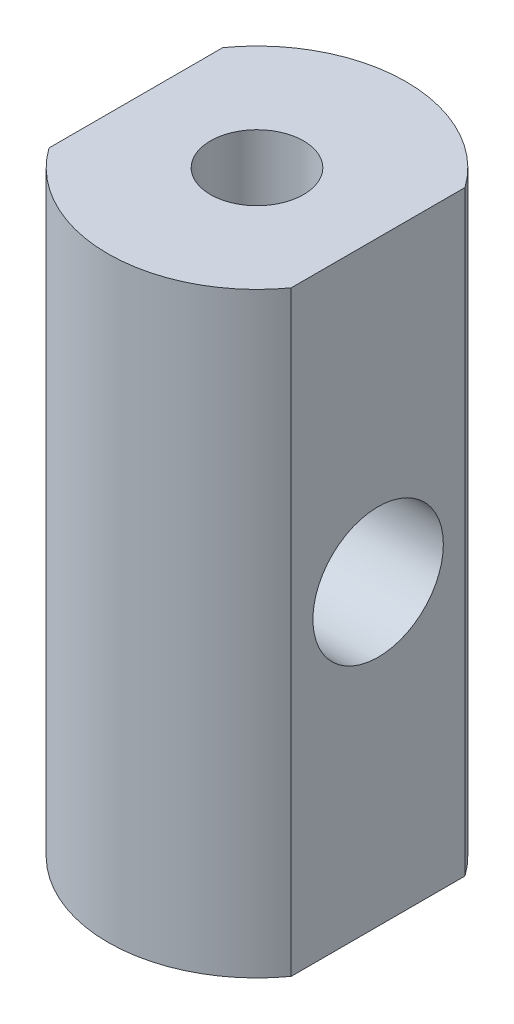
ISO-10303-21;
HEADER;
FILE_DESCRIPTION(('STEP AP214'),'2;1');
FILE_NAME('part.step','',(''),(''),'','','');
FILE_SCHEMA(('AUTOMOTIVE_DESIGN { 1 0 10303 214 1 1 1 1 }'));
ENDSEC;
DATA;
#1=APPLICATION_CONTEXT('core data for automotive mechanical design processes');
#2=APPLICATION_PROTOCOL_DEFINITION('international standard','automotive_design',2000,#1);
#3=PRODUCT_CONTEXT('',#1,'mechanical');
#4=PRODUCT('Part','Part','',(#3));
#5=PRODUCT_RELATED_PRODUCT_CATEGORY('part','',(#4));
#6=PRODUCT_DEFINITION_FORMATION('','',#4);
#7=PRODUCT_DEFINITION_CONTEXT('part definition',#1,'design');
#8=PRODUCT_DEFINITION('design','',#6,#7);
#9=PRODUCT_DEFINITION_SHAPE('','',#8);
#10=(LENGTH_UNIT() NAMED_UNIT(*) SI_UNIT(.MILLI.,.METRE.));
#11=(NAMED_UNIT(*) PLANE_ANGLE_UNIT() SI_UNIT($,.RADIAN.));
#12=(NAMED_UNIT(*) SI_UNIT($,.STERADIAN.) SOLID_ANGLE_UNIT());
#13=UNCERTAINTY_MEASURE_WITH_UNIT(LENGTH_MEASURE(1.E-05),#10,'distance_accuracy_value','');
#14=(GEOMETRIC_REPRESENTATION_CONTEXT(3) GLOBAL_UNCERTAINTY_ASSIGNED_CONTEXT((#13)) GLOBAL_UNIT_ASSIGNED_CONTEXT((#10,
#11,#12)) REPRESENTATION_CONTEXT('',''));
#15=CARTESIAN_POINT('',(0.,0.,0.));
#16=DIRECTION('',(0.,0.,1.));
#17=DIRECTION('',(1.,0.,0.));
#18=AXIS2_PLACEMENT_3D('',#15,#16,#17);
#19=CARTESIAN_POINT('',(0.,32.,0.));
#20=DIRECTION('',(0.,-1.,0.));
#21=DIRECTION('',(0.,0.,-1.));
#22=AXIS2_PLACEMENT_3D('',#19,#20,#21);
#23=CYLINDRICAL_SURFACE('',#22,8.);
#24=DIRECTION('',(0.,-1.,0.));
#25=VECTOR('',#24,1.);
#26=CARTESIAN_POINT('',(6.49999999999999,32.,4.66368952654442));
#27=LINE('',#26,#25);
#28=CARTESIAN_POINT('',(6.49999999999999,32.,4.66368952654442));
#29=VERTEX_POINT('',#28);
#30=CARTESIAN_POINT('',(6.5,0.,4.66368952654441));
#31=VERTEX_POINT('',#30);
#32=EDGE_CURVE('E66',#29,#31,#27,.T.);
#33=ORIENTED_EDGE('',*,*,#32,.F.);
#34=CARTESIAN_POINT('',(0.,32.,0.));
#35=DIRECTION('',(0.,1.,0.));
#36=DIRECTION('',(0.,0.,1.));
#37=AXIS2_PLACEMENT_3D('',#34,#35,#36);
#38=CIRCLE('',#37,8.);
#39=CARTESIAN_POINT('',(-6.49999999999999,32.,4.66368952654442));
#40=VERTEX_POINT('',#39);
#41=EDGE_CURVE('E101',#40,#29,#38,.T.);
#42=ORIENTED_EDGE('',*,*,#41,.F.);
#43=DIRECTION('',(0.,-1.,0.));
#44=VECTOR('',#43,1.);
#45=CARTESIAN_POINT('',(-6.49999999999999,32.,4.66368952654442));
#46=LINE('',#45,#44);
#47=CARTESIAN_POINT('',(-6.5,0.,4.66368952654441));
#48=VERTEX_POINT('',#47);
#49=EDGE_CURVE('E89',#48,#40,#46,.F.);
#50=ORIENTED_EDGE('',*,*,#49,.F.);
#51=CARTESIAN_POINT('',(0.,0.,0.));
#52=DIRECTION('',(0.,1.,0.));
#53=DIRECTION('',(0.,0.,1.));
#54=AXIS2_PLACEMENT_3D('',#51,#52,#53);
#55=CIRCLE('',#54,8.);
#56=EDGE_CURVE('E99',#48,#31,#55,.T.);
#57=ORIENTED_EDGE('',*,*,#56,.T.);
#58=EDGE_LOOP('',(#33,#42,#50,#57));
#59=FACE_BOUND('',#58,.T.);
#60=ADVANCED_FACE('F45',(#59),#23,.T.);
#61=DIRECTION('',(0.,-1.,0.));
#62=VECTOR('',#61,1.);
#63=CARTESIAN_POINT('',(6.49999999999999,32.,-4.66368952654442));
#64=LINE('',#63,#62);
#65=CARTESIAN_POINT('',(6.5,0.,-4.66368952654441));
#66=VERTEX_POINT('',#65);
#67=CARTESIAN_POINT('',(6.49999999999999,32.,-4.66368952654442));
#68=VERTEX_POINT('',#67);
#69=EDGE_CURVE('E125',#66,#68,#64,.F.);
#70=ORIENTED_EDGE('',*,*,#69,.F.);
#71=CARTESIAN_POINT('',(-6.5,0.,-4.66368952654441));
#72=VERTEX_POINT('',#71);
#73=EDGE_CURVE('E105',#66,#72,#55,.T.);
#74=ORIENTED_EDGE('',*,*,#73,.T.);
#75=DIRECTION('',(0.,-1.,0.));
#76=VECTOR('',#75,1.);
#77=CARTESIAN_POINT('',(-6.49999999999999,32.,-4.66368952654442));
#78=LINE('',#77,#76);
#79=CARTESIAN_POINT('',(-6.49999999999999,32.,-4.66368952654442));
#80=VERTEX_POINT('',#79);
#81=EDGE_CURVE('E59',#80,#72,#78,.T.);
#82=ORIENTED_EDGE('',*,*,#81,.F.);
#83=EDGE_CURVE('E95',#68,#80,#38,.T.);
#84=ORIENTED_EDGE('',*,*,#83,.F.);
#85=EDGE_LOOP('',(#70,#74,#82,#84));
#86=FACE_BOUND('',#85,.T.);
#87=ADVANCED_FACE('F152',(#86),#23,.T.);
#88=CARTESIAN_POINT('',(0.,32.,0.));
#89=DIRECTION('',(0.,1.,0.));
#90=DIRECTION('',(0.,0.,1.));
#91=AXIS2_PLACEMENT_3D('',#88,#89,#90);
#92=PLANE('',#91);
#93=CARTESIAN_POINT('',(0.,32.,0.));
#94=DIRECTION('',(0.,1.,0.));
#95=DIRECTION('',(0.,0.,1.));
#96=AXIS2_PLACEMENT_3D('',#93,#94,#95);
#97=CIRCLE('',#96,2.5);
#98=CARTESIAN_POINT('',(0.,32.,2.5));
#99=VERTEX_POINT('',#98);
#100=EDGE_CURVE('E109',#99,#99,#97,.T.);
#101=ORIENTED_EDGE('',*,*,#100,.F.);
#102=EDGE_LOOP('',(#101));
#103=FACE_BOUND('',#102,.T.);
#104=ORIENTED_EDGE('',*,*,#41,.T.);
#105=DIRECTION('',(0.,0.,-1.));
#106=VECTOR('',#105,1.);
#107=CARTESIAN_POINT('',(6.49999999999999,32.,0.));
#108=LINE('',#107,#106);
#109=EDGE_CURVE('E121',#29,#68,#108,.T.);
#110=ORIENTED_EDGE('',*,*,#109,.T.);
#111=ORIENTED_EDGE('',*,*,#83,.T.);
#112=DIRECTION('',(0.,0.,1.));
#113=VECTOR('',#112,1.);
#114=CARTESIAN_POINT('',(-6.49999999999999,32.,0.));
#115=LINE('',#114,#113);
#116=EDGE_CURVE('E127',#80,#40,#115,.T.);
#117=ORIENTED_EDGE('',*,*,#116,.T.);
#118=EDGE_LOOP('',(#104,#110,#111,#117));
#119=FACE_BOUND('',#118,.T.);
#120=ADVANCED_FACE('F157',(#103,#119),#92,.T.);
#121=CARTESIAN_POINT('',(0.,0.,0.));
#122=DIRECTION('',(0.,1.,0.));
#123=DIRECTION('',(0.,0.,1.));
#124=AXIS2_PLACEMENT_3D('',#121,#122,#123);
#125=PLANE('',#124);
#126=CARTESIAN_POINT('',(0.,0.,0.));
#127=DIRECTION('',(0.,-1.,0.));
#128=DIRECTION('',(0.,0.,-1.));
#129=AXIS2_PLACEMENT_3D('',#126,#127,#128);
#130=CIRCLE('',#129,2.5);
#131=CARTESIAN_POINT('',(0.,0.,-2.5));
#132=VERTEX_POINT('',#131);
#133=EDGE_CURVE('E118',#132,#132,#130,.T.);
#134=ORIENTED_EDGE('',*,*,#133,.F.);
#135=EDGE_LOOP('',(#134));
#136=FACE_BOUND('',#135,.T.);
#137=DIRECTION('',(0.,0.,-1.));
#138=VECTOR('',#137,1.);
#139=CARTESIAN_POINT('',(6.5,0.,0.));
#140=LINE('',#139,#138);
#141=EDGE_CURVE('E11',#31,#66,#140,.T.);
#142=ORIENTED_EDGE('',*,*,#141,.F.);
#143=ORIENTED_EDGE('',*,*,#56,.F.);
#144=DIRECTION('',(0.,0.,1.));
#145=VECTOR('',#144,1.);
#146=CARTESIAN_POINT('',(-6.5,0.,0.));
#147=LINE('',#146,#145);
#148=EDGE_CURVE('E52',#72,#48,#147,.T.);
#149=ORIENTED_EDGE('',*,*,#148,.F.);
#150=ORIENTED_EDGE('',*,*,#73,.F.);
#151=EDGE_LOOP('',(#142,#143,#149,#150));
#152=FACE_BOUND('',#151,.T.);
#153=ADVANCED_FACE('F104',(#136,#152),#125,.F.);
#154=CARTESIAN_POINT('',(0.,26.,0.));
#155=DIRECTION('',(0.,1.,0.));
#156=DIRECTION('',(0.,0.,1.));
#157=AXIS2_PLACEMENT_3D('',#154,#155,#156);
#158=CONICAL_SURFACE('',#157,2.5,1.02974425867665);
#159=CARTESIAN_POINT('',(0.,24.4978484524311,0.));
#160=VERTEX_POINT('',#159);
#161=VERTEX_LOOP('',#160);
#162=FACE_BOUND('',#161,.T.);
#163=CARTESIAN_POINT('',(0.,26.,0.));
#164=DIRECTION('',(0.,1.,0.));
#165=DIRECTION('',(0.,0.,1.));
#166=AXIS2_PLACEMENT_3D('',#163,#164,#165);
#167=CIRCLE('',#166,2.5);
#168=CARTESIAN_POINT('',(0.,26.,2.5));
#169=VERTEX_POINT('',#168);
#170=EDGE_CURVE('E106',#169,#169,#167,.T.);
#171=ORIENTED_EDGE('',*,*,#170,.T.);
#172=EDGE_LOOP('',(#171));
#173=FACE_BOUND('',#172,.T.);
#174=ADVANCED_FACE('F171',(#162,#173),#158,.F.);
#175=CARTESIAN_POINT('',(0.,32.,0.));
#176=DIRECTION('',(0.,1.,0.));
#177=DIRECTION('',(0.,0.,1.));
#178=AXIS2_PLACEMENT_3D('',#175,#176,#177);
#179=CYLINDRICAL_SURFACE('',#178,2.5);
#180=ORIENTED_EDGE('',*,*,#170,.F.);
#181=EDGE_LOOP('',(#180));
#182=FACE_BOUND('',#181,.T.);
#183=ORIENTED_EDGE('',*,*,#100,.T.);
#184=EDGE_LOOP('',(#183));
#185=FACE_BOUND('',#184,.T.);
#186=ADVANCED_FACE('F177',(#182,#185),#179,.F.);
#187=CARTESIAN_POINT('',(0.,6.,0.));
#188=DIRECTION('',(0.,-1.,0.));
#189=DIRECTION('',(0.,0.,-1.));
#190=AXIS2_PLACEMENT_3D('',#187,#188,#189);
#191=CONICAL_SURFACE('',#190,2.5,1.02974425867665);
#192=CARTESIAN_POINT('',(0.,7.5021515475689,0.));
#193=VERTEX_POINT('',#192);
#194=VERTEX_LOOP('',#193);
#195=FACE_BOUND('',#194,.T.);
#196=CARTESIAN_POINT('',(0.,6.,0.));
#197=DIRECTION('',(0.,-1.,0.));
#198=DIRECTION('',(0.,0.,-1.));
#199=AXIS2_PLACEMENT_3D('',#196,#197,#198);
#200=CIRCLE('',#199,2.5);
#201=CARTESIAN_POINT('',(0.,6.,-2.5));
#202=VERTEX_POINT('',#201);
#203=EDGE_CURVE('E115',#202,#202,#200,.T.);
#204=ORIENTED_EDGE('',*,*,#203,.T.);
#205=EDGE_LOOP('',(#204));
#206=FACE_BOUND('',#205,.T.);
#207=ADVANCED_FACE('F181',(#195,#206),#191,.F.);
#208=CARTESIAN_POINT('',(0.,0.,0.));
#209=DIRECTION('',(0.,-1.,0.));
#210=DIRECTION('',(0.,0.,-1.));
#211=AXIS2_PLACEMENT_3D('',#208,#209,#210);
#212=CYLINDRICAL_SURFACE('',#211,2.5);
#213=ORIENTED_EDGE('',*,*,#203,.F.);
#214=EDGE_LOOP('',(#213));
#215=FACE_BOUND('',#214,.T.);
#216=ORIENTED_EDGE('',*,*,#133,.T.);
#217=EDGE_LOOP('',(#216));
#218=FACE_BOUND('',#217,.T.);
#219=ADVANCED_FACE('F148',(#215,#218),#212,.F.);
#220=CARTESIAN_POINT('',(-6.5,-1.49999999999999,10.));
#221=DIRECTION('',(-1.,0.,0.));
#222=DIRECTION('',(0.,-1.,0.));
#223=AXIS2_PLACEMENT_3D('',#220,#221,#222);
#224=PLANE('',#223);
#225=CARTESIAN_POINT('',(-6.5,16.,0.));
#226=DIRECTION('',(1.,0.,0.));
#227=DIRECTION('',(0.,0.,-1.));
#228=AXIS2_PLACEMENT_3D('',#225,#226,#227);
#229=CIRCLE('',#228,3.5);
#230=CARTESIAN_POINT('',(-6.5,16.,-3.5));
#231=VERTEX_POINT('',#230);
#232=EDGE_CURVE('E102',#231,#231,#229,.T.);
#233=ORIENTED_EDGE('',*,*,#232,.T.);
#234=EDGE_LOOP('',(#233));
#235=FACE_BOUND('',#234,.T.);
#236=ORIENTED_EDGE('',*,*,#81,.T.);
#237=ORIENTED_EDGE('',*,*,#148,.T.);
#238=ORIENTED_EDGE('',*,*,#49,.T.);
#239=ORIENTED_EDGE('',*,*,#116,.F.);
#240=EDGE_LOOP('',(#236,#237,#238,#239));
#241=FACE_BOUND('',#240,.T.);
#242=ADVANCED_FACE('F88',(#235,#241),#224,.T.);
#243=CARTESIAN_POINT('',(6.5,-1.49999999999999,10.));
#244=DIRECTION('',(1.,0.,0.));
#245=DIRECTION('',(0.,1.,0.));
#246=AXIS2_PLACEMENT_3D('',#243,#244,#245);
#247=PLANE('',#246);
#248=CARTESIAN_POINT('',(6.5,16.,0.));
#249=DIRECTION('',(1.,0.,0.));
#250=DIRECTION('',(0.,0.,-1.));
#251=AXIS2_PLACEMENT_3D('',#248,#249,#250);
#252=CIRCLE('',#251,3.49999999999999);
#253=CARTESIAN_POINT('',(6.5,16.,-3.49999999999999));
#254=VERTEX_POINT('',#253);
#255=EDGE_CURVE('E132',#254,#254,#252,.T.);
#256=ORIENTED_EDGE('',*,*,#255,.F.);
#257=EDGE_LOOP('',(#256));
#258=FACE_BOUND('',#257,.T.);
#259=ORIENTED_EDGE('',*,*,#32,.T.);
#260=ORIENTED_EDGE('',*,*,#141,.T.);
#261=ORIENTED_EDGE('',*,*,#69,.T.);
#262=ORIENTED_EDGE('',*,*,#109,.F.);
#263=EDGE_LOOP('',(#259,#260,#261,#262));
#264=FACE_BOUND('',#263,.T.);
#265=ADVANCED_FACE('F138',(#258,#264),#247,.T.);
#266=CARTESIAN_POINT('',(6.5,16.,0.));
#267=DIRECTION('',(1.,0.,0.));
#268=DIRECTION('',(0.,0.,-1.));
#269=AXIS2_PLACEMENT_3D('',#266,#267,#268);
#270=CYLINDRICAL_SURFACE('',#269,3.49999999999999);
#271=ORIENTED_EDGE('',*,*,#232,.F.);
#272=EDGE_LOOP('',(#271));
#273=FACE_BOUND('',#272,.T.);
#274=ORIENTED_EDGE('',*,*,#255,.T.);
#275=EDGE_LOOP('',(#274));
#276=FACE_BOUND('',#275,.T.);
#277=ADVANCED_FACE('F136',(#273,#276),#270,.F.);
#278=CLOSED_SHELL('',(#60,#87,#120,#153,#174,#186,#207,#219,#242,#265,#277));
#279=MANIFOLD_SOLID_BREP('B2',#278);
#280=ADVANCED_BREP_SHAPE_REPRESENTATION('',(#18,#279),#14);
#281=SHAPE_DEFINITION_REPRESENTATION(#9,#280);
ENDSEC;
END-ISO-10303-21;
